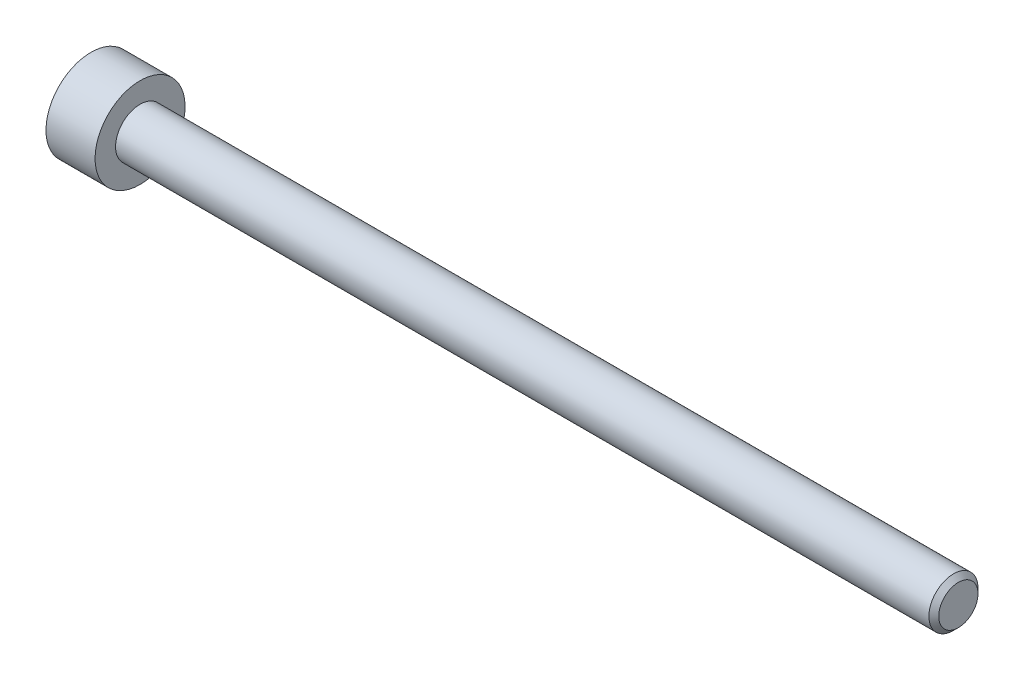
ISO-10303-21;
HEADER;
FILE_DESCRIPTION(('STEP AP214'),'2;1');
FILE_NAME('part.step','',(''),(''),'','','');
FILE_SCHEMA(('AUTOMOTIVE_DESIGN { 1 0 10303 214 1 1 1 1 }'));
ENDSEC;
DATA;
#1=APPLICATION_CONTEXT('core data for automotive mechanical design processes');
#2=APPLICATION_PROTOCOL_DEFINITION('international standard','automotive_design',2000,#1);
#3=PRODUCT_CONTEXT('',#1,'mechanical');
#4=PRODUCT('Part','Part','',(#3));
#5=PRODUCT_RELATED_PRODUCT_CATEGORY('part','',(#4));
#6=PRODUCT_DEFINITION_FORMATION('','',#4);
#7=PRODUCT_DEFINITION_CONTEXT('part definition',#1,'design');
#8=PRODUCT_DEFINITION('design','',#6,#7);
#9=PRODUCT_DEFINITION_SHAPE('','',#8);
#10=(LENGTH_UNIT() NAMED_UNIT(*) SI_UNIT(.MILLI.,.METRE.));
#11=(NAMED_UNIT(*) PLANE_ANGLE_UNIT() SI_UNIT($,.RADIAN.));
#12=(NAMED_UNIT(*) SI_UNIT($,.STERADIAN.) SOLID_ANGLE_UNIT());
#13=UNCERTAINTY_MEASURE_WITH_UNIT(LENGTH_MEASURE(1.E-05),#10,'distance_accuracy_value','');
#14=(GEOMETRIC_REPRESENTATION_CONTEXT(3) GLOBAL_UNCERTAINTY_ASSIGNED_CONTEXT((#13)) GLOBAL_UNIT_ASSIGNED_CONTEXT((#10,
#11,#12)) REPRESENTATION_CONTEXT('',''));
#15=CARTESIAN_POINT('',(0.,0.,0.));
#16=DIRECTION('',(0.,0.,1.));
#17=DIRECTION('',(1.,0.,0.));
#18=AXIS2_PLACEMENT_3D('',#15,#16,#17);
#19=CARTESIAN_POINT('',(-50.,0.,0.));
#20=DIRECTION('',(1.,0.,0.));
#21=DIRECTION('',(0.,0.,-1.));
#22=AXIS2_PLACEMENT_3D('',#19,#20,#21);
#23=CYLINDRICAL_SURFACE('',#22,1.5);
#24=CARTESIAN_POINT('',(-0.300000000000002,0.,0.));
#25=DIRECTION('',(1.,0.,0.));
#26=DIRECTION('',(0.,0.,-1.));
#27=AXIS2_PLACEMENT_3D('',#24,#25,#26);
#28=CIRCLE('',#27,1.5);
#29=CARTESIAN_POINT('',(-0.300000000000002,0.,-1.5));
#30=VERTEX_POINT('',#29);
#31=EDGE_CURVE('E46',#30,#30,#28,.F.);
#32=ORIENTED_EDGE('',*,*,#31,.T.);
#33=EDGE_LOOP('',(#32));
#34=FACE_BOUND('',#33,.T.);
#35=CARTESIAN_POINT('',(-50.,0.,0.));
#36=DIRECTION('',(-1.,0.,0.));
#37=DIRECTION('',(0.,-1.,0.));
#38=AXIS2_PLACEMENT_3D('',#35,#36,#37);
#39=CIRCLE('',#38,1.5);
#40=CARTESIAN_POINT('',(-50.,-1.50000000000001,0.));
#41=VERTEX_POINT('',#40);
#42=EDGE_CURVE('E122',#41,#41,#39,.F.);
#43=ORIENTED_EDGE('',*,*,#42,.T.);
#44=EDGE_LOOP('',(#43));
#45=FACE_BOUND('',#44,.T.);
#46=ADVANCED_FACE('F33',(#34,#45),#23,.T.);
#47=CARTESIAN_POINT('',(0.,0.,0.));
#48=DIRECTION('',(1.,0.,0.));
#49=DIRECTION('',(0.,0.,-1.));
#50=AXIS2_PLACEMENT_3D('',#47,#48,#49);
#51=PLANE('',#50);
#52=CARTESIAN_POINT('',(0.,0.,0.));
#53=DIRECTION('',(1.,0.,0.));
#54=DIRECTION('',(0.,0.,-1.));
#55=AXIS2_PLACEMENT_3D('',#52,#53,#54);
#56=CIRCLE('',#55,1.2);
#57=CARTESIAN_POINT('',(0.,0.,-1.2));
#58=VERTEX_POINT('',#57);
#59=EDGE_CURVE('E125',#58,#58,#56,.T.);
#60=ORIENTED_EDGE('',*,*,#59,.T.);
#61=EDGE_LOOP('',(#60));
#62=FACE_BOUND('',#61,.T.);
#63=ADVANCED_FACE('F135',(#62),#51,.T.);
#64=CARTESIAN_POINT('',(0.,0.,0.));
#65=DIRECTION('',(-1.,0.,0.));
#66=DIRECTION('',(0.,0.,1.));
#67=AXIS2_PLACEMENT_3D('',#64,#65,#66);
#68=CONICAL_SURFACE('',#67,1.2,0.785398163397447);
#69=ORIENTED_EDGE('',*,*,#31,.F.);
#70=EDGE_LOOP('',(#69));
#71=FACE_BOUND('',#70,.T.);
#72=ORIENTED_EDGE('',*,*,#59,.F.);
#73=EDGE_LOOP('',(#72));
#74=FACE_BOUND('',#73,.T.);
#75=ADVANCED_FACE('F35',(#71,#74),#68,.T.);
#76=CARTESIAN_POINT('',(-53.,0.,0.));
#77=DIRECTION('',(1.,0.,0.));
#78=DIRECTION('',(0.,1.,0.));
#79=AXIS2_PLACEMENT_3D('',#76,#77,#78);
#80=PLANE('',#79);
#81=CARTESIAN_POINT('',(-53.,1.83044599404149E-13,0.));
#82=DIRECTION('',(-1.,0.,0.));
#83=DIRECTION('',(0.,-1.,0.));
#84=AXIS2_PLACEMENT_3D('',#81,#82,#83);
#85=CIRCLE('',#84,1.49337567297404);
#86=CARTESIAN_POINT('',(-53.,-1.49337567297386,0.));
#87=VERTEX_POINT('',#86);
#88=EDGE_CURVE('E235',#87,#87,#85,.T.);
#89=ORIENTED_EDGE('',*,*,#88,.F.);
#90=EDGE_LOOP('',(#89));
#91=FACE_BOUND('',#90,.T.);
#92=CARTESIAN_POINT('',(-53.,0.,0.));
#93=DIRECTION('',(-1.,0.,0.));
#94=DIRECTION('',(0.,-1.,0.));
#95=AXIS2_PLACEMENT_3D('',#92,#93,#94);
#96=CIRCLE('',#95,2.75);
#97=CARTESIAN_POINT('',(-53.,-2.75,0.));
#98=VERTEX_POINT('',#97);
#99=EDGE_CURVE('E119',#98,#98,#96,.T.);
#100=ORIENTED_EDGE('',*,*,#99,.T.);
#101=EDGE_LOOP('',(#100));
#102=FACE_BOUND('',#101,.T.);
#103=ADVANCED_FACE('F134',(#91,#102),#80,.F.);
#104=CARTESIAN_POINT('',(-50.,0.,0.));
#105=DIRECTION('',(-1.,0.,0.));
#106=DIRECTION('',(0.,-1.,0.));
#107=AXIS2_PLACEMENT_3D('',#104,#105,#106);
#108=CYLINDRICAL_SURFACE('',#107,2.75);
#109=ORIENTED_EDGE('',*,*,#99,.F.);
#110=EDGE_LOOP('',(#109));
#111=FACE_BOUND('',#110,.T.);
#112=CARTESIAN_POINT('',(-50.,0.,0.));
#113=DIRECTION('',(-1.,0.,0.));
#114=DIRECTION('',(0.,-1.,0.));
#115=AXIS2_PLACEMENT_3D('',#112,#113,#114);
#116=CIRCLE('',#115,2.75);
#117=CARTESIAN_POINT('',(-50.,-2.75,0.));
#118=VERTEX_POINT('',#117);
#119=EDGE_CURVE('E116',#118,#118,#116,.T.);
#120=ORIENTED_EDGE('',*,*,#119,.T.);
#121=EDGE_LOOP('',(#120));
#122=FACE_BOUND('',#121,.T.);
#123=ADVANCED_FACE('F146',(#111,#122),#108,.T.);
#124=CARTESIAN_POINT('',(-50.,2.75,0.));
#125=DIRECTION('',(-1.,0.,0.));
#126=DIRECTION('',(0.,-1.,0.));
#127=AXIS2_PLACEMENT_3D('',#124,#125,#126);
#128=PLANE('',#127);
#129=ORIENTED_EDGE('',*,*,#42,.F.);
#130=EDGE_LOOP('',(#129));
#131=FACE_BOUND('',#130,.T.);
#132=ORIENTED_EDGE('',*,*,#119,.F.);
#133=EDGE_LOOP('',(#132));
#134=FACE_BOUND('',#133,.T.);
#135=ADVANCED_FACE('F150',(#131,#134),#128,.F.);
#136=CARTESIAN_POINT('',(-53.,1.83044599404149E-13,0.));
#137=DIRECTION('',(-1.,0.,0.));
#138=DIRECTION('',(0.,-1.,0.));
#139=AXIS2_PLACEMENT_3D('',#136,#137,#138);
#140=CONICAL_SURFACE('',#139,1.49337567297404,0.78539816339745);
#141=ORIENTED_EDGE('',*,*,#88,.T.);
#142=EDGE_LOOP('',(#141));
#143=FACE_BOUND('',#142,.T.);
#144=CARTESIAN_POINT('',(-53.4014021689884,-1.42396736984779,1.25));
#145=CARTESIAN_POINT('',(-53.3752961364481,-1.38922450814756,1.25));
#146=CARTESIAN_POINT('',(-53.3494506563432,-1.35428640192978,1.25));
#147=CARTESIAN_POINT('',(-53.2983879120234,-1.28394100441944,1.25));
#148=CARTESIAN_POINT('',(-53.2731708093588,-1.24853359598558,1.25));
#149=CARTESIAN_POINT('',(-53.1982633539511,-1.14097140016101,1.25));
#150=CARTESIAN_POINT('',(-53.1497190435972,-1.06800495826732,1.25));
#151=CARTESIAN_POINT('',(-53.0545600162985,-0.915095472420173,1.25));
#152=CARTESIAN_POINT('',(-53.0082030382604,-0.834990154954319,1.25));
#153=CARTESIAN_POINT('',(-52.9235039270025,-0.67079834895924,1.25));
#154=CARTESIAN_POINT('',(-52.8851347978723,-0.58672648793699,1.25));
#155=CARTESIAN_POINT('',(-52.8381985020476,-0.460385334768531,1.25));
#156=CARTESIAN_POINT('',(-52.8247021207699,-0.419954113336438,1.25));
#157=CARTESIAN_POINT('',(-52.8009573074475,-0.338129031291116,1.25));
#158=CARTESIAN_POINT('',(-52.7907091035293,-0.29673510328401,1.25));
#159=CARTESIAN_POINT('',(-52.7741594663553,-0.213916243687624,1.25));
#160=CARTESIAN_POINT('',(-52.7677913385526,-0.172504848949173,1.25));
#161=CARTESIAN_POINT('',(-52.7591237196609,-0.0892560954740315,1.25));
#162=CARTESIAN_POINT('',(-52.7568235599982,-0.0474188078701397,1.25));
#163=CARTESIAN_POINT('',(-52.7564564105194,0.0348235296906662,1.25));
#164=CARTESIAN_POINT('',(-52.7582455485416,0.0752279922918425,1.25));
#165=CARTESIAN_POINT('',(-52.7656448035135,0.15568700557977,1.25));
#166=CARTESIAN_POINT('',(-52.7712556629701,0.195741486738124,1.25));
#167=CARTESIAN_POINT('',(-52.7860898151071,0.275882483894831,1.25));
#168=CARTESIAN_POINT('',(-52.7953738895404,0.315957579678935,1.25));
#169=CARTESIAN_POINT('',(-52.8170656964993,0.395234027395441,1.25));
#170=CARTESIAN_POINT('',(-52.8294731489785,0.434435457319079,1.25));
#171=CARTESIAN_POINT('',(-52.8734108304631,0.558570325397279,1.25));
#172=CARTESIAN_POINT('',(-52.909974414329,0.641718054006102,1.25));
#173=CARTESIAN_POINT('',(-52.9912478873067,0.804100725662247,1.25));
#174=CARTESIAN_POINT('',(-53.0359871895298,0.883320183916037,1.25));
#175=CARTESIAN_POINT('',(-53.1282652286461,1.03470895505839,1.25));
#176=CARTESIAN_POINT('',(-53.1755534388818,1.10703287925054,1.25));
#177=CARTESIAN_POINT('',(-53.2486463209253,1.21358798649207,1.25));
#178=CARTESIAN_POINT('',(-53.2732664432996,1.24864609054898,1.25));
#179=CARTESIAN_POINT('',(-53.3231552601311,1.31828380805665,1.25));
#180=CARTESIAN_POINT('',(-53.3484237758018,1.3528635494471,1.25));
#181=CARTESIAN_POINT('',(-53.3739610581169,1.38724419886404,1.25));
#182=B_SPLINE_CURVE_WITH_KNOTS('',3,(#144,#145,#146,#147,#148,#149,#150,#151,#152,#153,#154,
#155,#156,#157,#158,#159,#160,#161,#162,#163,#164,#165,#166,#167,#168,#169,#170,#171,#172,#173,
#174,#175,#176,#177,#178,#179,#180,#181),.UNSPECIFIED.,.F.,.F.,(4,2,2,2,2,2,2,2,2,2,2,2,2,2,2,2,
2,2,4),(0.,0.130370422461745,0.26077402322927,0.523571931962165,0.800995227642772,
1.07746514553939,1.2052297268728,1.33300327939669,1.45851355132212,1.58400319361986,
1.70514602294318,1.82631239533593,1.94957373840988,2.07282403363802,2.34451838945518,
2.61721016161581,2.87631588769059,3.00482945023597,3.13330794967359),.UNSPECIFIED.);
#183=CARTESIAN_POINT('',(-52.95,-0.72168783648685,1.25));
#184=VERTEX_POINT('',#183);
#185=CARTESIAN_POINT('',(-52.95,0.721687836487215,1.25));
#186=VERTEX_POINT('',#185);
#187=EDGE_CURVE('E100',#184,#186,#182,.T.);
#188=ORIENTED_EDGE('',*,*,#187,.F.);
#189=CARTESIAN_POINT('',(-52.9501154839092,-1.44349114302772,-0.000200000000000036));
#190=CARTESIAN_POINT('',(-52.9253216680551,-1.41867941875047,0.0427751670715862));
#191=CARTESIAN_POINT('',(-52.9019837344187,-1.39345276980725,0.086469004745948));
#192=CARTESIAN_POINT('',(-52.8592520040846,-1.34201263554176,0.175565930841943));
#193=CARTESIAN_POINT('',(-52.8398819923604,-1.31579425481258,0.220977498357066));
#194=CARTESIAN_POINT('',(-52.8067004834135,-1.26292610442228,0.312547820935263));
#195=CARTESIAN_POINT('',(-52.7928055590527,-1.23628980770453,0.358683240175889));
#196=CARTESIAN_POINT('',(-52.7713972821607,-1.1824306253849,0.451970080407596));
#197=CARTESIAN_POINT('',(-52.7638679415668,-1.15520938653743,0.499118649136384));
#198=CARTESIAN_POINT('',(-52.7570744980507,-1.10829684367448,0.580373556887257));
#199=CARTESIAN_POINT('',(-52.7560685591044,-1.08866617256939,0.614374876627945));
#200=CARTESIAN_POINT('',(-52.7577614149114,-1.04943932800592,0.682317764432482));
#201=CARTESIAN_POINT('',(-52.7604610272156,-1.02984316311581,0.716259317655662));
#202=CARTESIAN_POINT('',(-52.7694089303164,-0.990839954603314,0.783814856457504));
#203=CARTESIAN_POINT('',(-52.7756605258997,-0.971433104248585,0.81742850728678));
#204=CARTESIAN_POINT('',(-52.7913756814139,-0.93294339560972,0.884094638217818));
#205=CARTESIAN_POINT('',(-52.8008406200875,-0.913860680098115,0.9171468710303));
#206=CARTESIAN_POINT('',(-52.8289313906876,-0.864986351354384,1.00179969160027));
#207=CARTESIAN_POINT('',(-52.8496701574522,-0.835502920148893,1.05286649242964));
#208=CARTESIAN_POINT('',(-52.8963871346715,-0.777690319475726,1.15300085411325));
#209=CARTESIAN_POINT('',(-52.9223482959468,-0.749357745598233,1.20207431157827));
#210=CARTESIAN_POINT('',(-52.9501154839092,-0.721572366433011,1.2502));
#211=B_SPLINE_CURVE_WITH_KNOTS('',3,(#189,#190,#191,#192,#193,#194,#195,#196,#197,#198,#199,
#200,#201,#202,#203,#204,#205,#206,#207,#208,#209,#210),.UNSPECIFIED.,.F.,.F.,(4,2,2,2,2,2,2,2,
2,2,4),(0.,0.166533409618304,0.334037607289763,0.498880396489702,0.663307919240279,
0.780963963458831,0.898645970148458,1.01643764860774,1.1342799317155,1.3214865203214,
1.50809158792574),.UNSPECIFIED.);
#212=CARTESIAN_POINT('',(-52.95,-1.44337567297388,0.));
#213=VERTEX_POINT('',#212);
#214=EDGE_CURVE('E192',#213,#184,#211,.T.);
#215=ORIENTED_EDGE('',*,*,#214,.F.);
#216=CARTESIAN_POINT('',(-52.9501154839092,-0.721572366433011,-1.2502));
#217=CARTESIAN_POINT('',(-52.9253216680551,-0.746384090710261,-1.20722483292841));
#218=CARTESIAN_POINT('',(-52.9019837344187,-0.771610739653482,-1.16353099525405));
#219=CARTESIAN_POINT('',(-52.8592520040846,-0.823050873918973,-1.07443406915806));
#220=CARTESIAN_POINT('',(-52.8398819923604,-0.849269254648152,-1.02902250164293));
#221=CARTESIAN_POINT('',(-52.8067004834135,-0.902137405038455,-0.937452179064736));
#222=CARTESIAN_POINT('',(-52.7928055590527,-0.928773701756207,-0.891316759824109));
#223=CARTESIAN_POINT('',(-52.7713972821607,-0.982632884075834,-0.798029919592401));
#224=CARTESIAN_POINT('',(-52.7638679415668,-1.0098541229233,-0.750881350863614));
#225=CARTESIAN_POINT('',(-52.7570744980507,-1.05676666578625,-0.669626443112742));
#226=CARTESIAN_POINT('',(-52.7560685591044,-1.07639733689134,-0.635625123372054));
#227=CARTESIAN_POINT('',(-52.7577614149114,-1.11562418145481,-0.567682235567517));
#228=CARTESIAN_POINT('',(-52.7604610272156,-1.13522034634492,-0.533740682344337));
#229=CARTESIAN_POINT('',(-52.7694089303164,-1.17422355485742,-0.466185143542494));
#230=CARTESIAN_POINT('',(-52.7756605258997,-1.19363040521215,-0.432571492713218));
#231=CARTESIAN_POINT('',(-52.7913756814139,-1.23212011385101,-0.36590536178218));
#232=CARTESIAN_POINT('',(-52.8008406200875,-1.25120282936262,-0.332853128969698));
#233=CARTESIAN_POINT('',(-52.8289313906876,-1.30007715810635,-0.248200308399731));
#234=CARTESIAN_POINT('',(-52.8496701574522,-1.32956058931184,-0.197133507570358));
#235=CARTESIAN_POINT('',(-52.8963871346715,-1.38737318998501,-0.096999145886744));
#236=CARTESIAN_POINT('',(-52.9223482959468,-1.4157057638625,-0.0479256884217305));
#237=CARTESIAN_POINT('',(-52.9501154839092,-1.44349114302772,0.000199999999998401));
#238=B_SPLINE_CURVE_WITH_KNOTS('',3,(#216,#217,#218,#219,#220,#221,#222,#223,#224,#225,#226,
#227,#228,#229,#230,#231,#232,#233,#234,#235,#236,#237),.UNSPECIFIED.,.F.,.F.,(4,2,2,2,2,2,2,2,
2,2,4),(0.,0.166533409618306,0.334037607289768,0.498880396489707,0.663307919240282,
0.780963963458834,0.898645970148461,1.01643764860774,1.1342799317155,1.32148652032141,
1.50809158792573),.UNSPECIFIED.);
#239=CARTESIAN_POINT('',(-52.95,-0.721687836486849,-1.25));
#240=VERTEX_POINT('',#239);
#241=EDGE_CURVE('E187',#240,#213,#238,.T.);
#242=ORIENTED_EDGE('',*,*,#241,.F.);
#243=CARTESIAN_POINT('',(-53.4014021689884,-1.42396736984779,-1.25));
#244=CARTESIAN_POINT('',(-53.3752961364481,-1.38922450814756,-1.25));
#245=CARTESIAN_POINT('',(-53.3494506563432,-1.35428640192978,-1.25));
#246=CARTESIAN_POINT('',(-53.2983879120234,-1.28394100441944,-1.25));
#247=CARTESIAN_POINT('',(-53.2731708093588,-1.24853359598558,-1.25));
#248=CARTESIAN_POINT('',(-53.1982633539511,-1.14097140016101,-1.25));
#249=CARTESIAN_POINT('',(-53.1497190435972,-1.06800495826732,-1.25));
#250=CARTESIAN_POINT('',(-53.0545600162985,-0.915095472420172,-1.25));
#251=CARTESIAN_POINT('',(-53.0082030382604,-0.834990154954318,-1.25));
#252=CARTESIAN_POINT('',(-52.9235039270025,-0.670798348959239,-1.25));
#253=CARTESIAN_POINT('',(-52.8851347978723,-0.586726487936988,-1.25));
#254=CARTESIAN_POINT('',(-52.8381985020476,-0.46038533476853,-1.25));
#255=CARTESIAN_POINT('',(-52.8247021207699,-0.419954113336438,-1.25));
#256=CARTESIAN_POINT('',(-52.8009573074475,-0.338129031291118,-1.25));
#257=CARTESIAN_POINT('',(-52.7907091035293,-0.296735103284012,-1.25));
#258=CARTESIAN_POINT('',(-52.7741594663553,-0.213916243687626,-1.25));
#259=CARTESIAN_POINT('',(-52.7677913385526,-0.172504848949175,-1.25));
#260=CARTESIAN_POINT('',(-52.7591237196609,-0.0892560954740335,-1.25));
#261=CARTESIAN_POINT('',(-52.7568235599982,-0.0474188078701416,-1.25));
#262=CARTESIAN_POINT('',(-52.7564564105194,0.0348235296906646,-1.25));
#263=CARTESIAN_POINT('',(-52.7582455485416,0.0752279922918411,-1.25));
#264=CARTESIAN_POINT('',(-52.7656448035135,0.155687005579769,-1.25));
#265=CARTESIAN_POINT('',(-52.7712556629701,0.195741486738123,-1.25));
#266=CARTESIAN_POINT('',(-52.7860898151071,0.27588248389483,-1.25));
#267=CARTESIAN_POINT('',(-52.7953738895404,0.315957579678934,-1.25));
#268=CARTESIAN_POINT('',(-52.8170656964993,0.395234027395441,-1.25));
#269=CARTESIAN_POINT('',(-52.8294731489785,0.434435457319079,-1.25));
#270=CARTESIAN_POINT('',(-52.8734108304631,0.558570325397279,-1.25));
#271=CARTESIAN_POINT('',(-52.909974414329,0.641718054006102,-1.25));
#272=CARTESIAN_POINT('',(-52.9912478873067,0.804100725662245,-1.25));
#273=CARTESIAN_POINT('',(-53.0359871895298,0.883320183916035,-1.25));
#274=CARTESIAN_POINT('',(-53.1282652286461,1.03470895505838,-1.25));
#275=CARTESIAN_POINT('',(-53.1755534388818,1.10703287925054,-1.25));
#276=CARTESIAN_POINT('',(-53.2486463209253,1.21358798649207,-1.25));
#277=CARTESIAN_POINT('',(-53.2732664432996,1.24864609054898,-1.25));
#278=CARTESIAN_POINT('',(-53.3231552601311,1.31828380805665,-1.25));
#279=CARTESIAN_POINT('',(-53.3484237758018,1.3528635494471,-1.25));
#280=CARTESIAN_POINT('',(-53.3739610581169,1.38724419886404,-1.25));
#281=B_SPLINE_CURVE_WITH_KNOTS('',3,(#243,#244,#245,#246,#247,#248,#249,#250,#251,#252,#253,
#254,#255,#256,#257,#258,#259,#260,#261,#262,#263,#264,#265,#266,#267,#268,#269,#270,#271,#272,
#273,#274,#275,#276,#277,#278,#279,#280),.UNSPECIFIED.,.F.,.F.,(4,2,2,2,2,2,2,2,2,2,2,2,2,2,2,2,
2,2,4),(0.,0.130370422461745,0.260774023229269,0.523571931962165,0.800995227642772,
1.07746514553939,1.2052297268728,1.33300327939668,1.45851355132212,1.58400319361986,
1.70514602294318,1.82631239533593,1.94957373840988,2.07282403363802,2.34451838945518,
2.61721016161581,2.87631588769058,3.00482945023597,3.13330794967358),.UNSPECIFIED.);
#282=CARTESIAN_POINT('',(-52.95,0.721687836487215,-1.25));
#283=VERTEX_POINT('',#282);
#284=EDGE_CURVE('E53',#283,#240,#281,.F.);
#285=ORIENTED_EDGE('',*,*,#284,.F.);
#286=CARTESIAN_POINT('',(-52.9501154839092,1.44349114302809,0.000200000000001351));
#287=CARTESIAN_POINT('',(-52.9253216680551,1.41867941875083,-0.042775167071587));
#288=CARTESIAN_POINT('',(-52.9019837344187,1.39345276980761,-0.0864690047459488));
#289=CARTESIAN_POINT('',(-52.8592520040846,1.34201263554212,-0.175565930841943));
#290=CARTESIAN_POINT('',(-52.8398819923604,1.31579425481295,-0.220977498357064));
#291=CARTESIAN_POINT('',(-52.8067004834135,1.26292610442264,-0.312547820935261));
#292=CARTESIAN_POINT('',(-52.7928055590527,1.23628980770489,-0.358683240175889));
#293=CARTESIAN_POINT('',(-52.7713972821607,1.18243062538526,-0.451970080407597));
#294=CARTESIAN_POINT('',(-52.7638679415668,1.15520938653779,-0.499118649136384));
#295=CARTESIAN_POINT('',(-52.7570744980507,1.10829684367485,-0.580373556887257));
#296=CARTESIAN_POINT('',(-52.7560685591044,1.08866617256976,-0.614374876627946));
#297=CARTESIAN_POINT('',(-52.7577614149113,1.04943932800629,-0.682317764432483));
#298=CARTESIAN_POINT('',(-52.7604610272156,1.02984316311617,-0.716259317655663));
#299=CARTESIAN_POINT('',(-52.7694089303164,0.990839954603678,-0.783814856457505));
#300=CARTESIAN_POINT('',(-52.7756605258997,0.971433104248949,-0.817428507286781));
#301=CARTESIAN_POINT('',(-52.7913756814139,0.932943395610084,-0.884094638217819));
#302=CARTESIAN_POINT('',(-52.8008406200875,0.913860680098479,-0.917146871030302));
#303=CARTESIAN_POINT('',(-52.8289313906876,0.864986351354747,-1.00179969160027));
#304=CARTESIAN_POINT('',(-52.8496701574522,0.835502920149256,-1.05286649242964));
#305=CARTESIAN_POINT('',(-52.8963871346715,0.77769031947609,-1.15300085411326));
#306=CARTESIAN_POINT('',(-52.9223482959468,0.749357745598599,-1.20207431157827));
#307=CARTESIAN_POINT('',(-52.9501154839092,0.721572366433378,-1.2502));
#308=B_SPLINE_CURVE_WITH_KNOTS('',3,(#286,#287,#288,#289,#290,#291,#292,#293,#294,#295,#296,
#297,#298,#299,#300,#301,#302,#303,#304,#305,#306,#307),.UNSPECIFIED.,.F.,.F.,(4,2,2,2,2,2,2,2,
2,2,4),(0.,0.166533409618306,0.334037607289766,0.498880396489705,0.663307919240282,
0.780963963458835,0.898645970148461,1.01643764860774,1.1342799317155,1.32148652032141,
1.50809158792574),.UNSPECIFIED.);
#309=CARTESIAN_POINT('',(-52.95,1.44337567297425,0.));
#310=VERTEX_POINT('',#309);
#311=EDGE_CURVE('E11',#310,#283,#308,.T.);
#312=ORIENTED_EDGE('',*,*,#311,.F.);
#313=CARTESIAN_POINT('',(-52.9501154839092,0.721572366433377,1.2502));
#314=CARTESIAN_POINT('',(-52.9253216680551,0.746384090710626,1.20722483292841));
#315=CARTESIAN_POINT('',(-52.9019837344187,0.771610739653846,1.16353099525405));
#316=CARTESIAN_POINT('',(-52.8592520040846,0.823050873919337,1.07443406915806));
#317=CARTESIAN_POINT('',(-52.8398819923604,0.849269254648517,1.02902250164293));
#318=CARTESIAN_POINT('',(-52.8067004834135,0.90213740503882,0.937452179064737));
#319=CARTESIAN_POINT('',(-52.7928055590527,0.928773701756571,0.891316759824112));
#320=CARTESIAN_POINT('',(-52.7713972821607,0.982632884076197,0.798029919592404));
#321=CARTESIAN_POINT('',(-52.7638679415668,1.00985412292367,0.750881350863616));
#322=CARTESIAN_POINT('',(-52.7570744980507,1.05676666578661,0.669626443112742));
#323=CARTESIAN_POINT('',(-52.7560685591044,1.0763973368917,0.635625123372054));
#324=CARTESIAN_POINT('',(-52.7577614149113,1.11562418145517,0.567682235567517));
#325=CARTESIAN_POINT('',(-52.7604610272156,1.13522034634529,0.533740682344337));
#326=CARTESIAN_POINT('',(-52.7694089303164,1.17422355485778,0.466185143542495));
#327=CARTESIAN_POINT('',(-52.7756605258997,1.19363040521251,0.43257149271322));
#328=CARTESIAN_POINT('',(-52.7913756814139,1.23212011385138,0.365905361782182));
#329=CARTESIAN_POINT('',(-52.8008406200875,1.25120282936298,0.332853128969699));
#330=CARTESIAN_POINT('',(-52.8289313906876,1.30007715810671,0.248200308399731));
#331=CARTESIAN_POINT('',(-52.8496701574522,1.32956058931221,0.197133507570358));
#332=CARTESIAN_POINT('',(-52.8963871346715,1.38737318998537,0.0969991458867434));
#333=CARTESIAN_POINT('',(-52.9223482959468,1.41570576386286,0.0479256884217296));
#334=CARTESIAN_POINT('',(-52.9501154839092,1.44349114302809,-0.000200000000000298));
#335=B_SPLINE_CURVE_WITH_KNOTS('',3,(#313,#314,#315,#316,#317,#318,#319,#320,#321,#322,#323,
#324,#325,#326,#327,#328,#329,#330,#331,#332,#333,#334),.UNSPECIFIED.,.F.,.F.,(4,2,2,2,2,2,2,2,
2,2,4),(0.,0.166533409618302,0.334037607289763,0.498880396489701,0.663307919240279,
0.780963963458832,0.898645970148458,1.01643764860774,1.1342799317155,1.32148652032141,
1.50809158792574),.UNSPECIFIED.);
#336=EDGE_CURVE('E91',#186,#310,#335,.T.);
#337=ORIENTED_EDGE('',*,*,#336,.F.);
#338=EDGE_LOOP('',(#188,#215,#242,#285,#312,#337));
#339=FACE_BOUND('',#338,.T.);
#340=ADVANCED_FACE('F90',(#143,#339),#140,.F.);
#341=CARTESIAN_POINT('',(-51.4,5.03476744051005E-13,0.));
#342=DIRECTION('',(-1.,0.,0.));
#343=DIRECTION('',(0.,-1.,0.));
#344=AXIS2_PLACEMENT_3D('',#341,#342,#343);
#345=PLANE('',#344);
#346=DIRECTION('',(0.,0.5,-0.866025403784439));
#347=VECTOR('',#346,1.);
#348=CARTESIAN_POINT('',(-51.4,0.721687836487209,1.25));
#349=LINE('',#348,#347);
#350=CARTESIAN_POINT('',(-51.4,0.721687836487209,1.25));
#351=VERTEX_POINT('',#350);
#352=CARTESIAN_POINT('',(-51.4,1.44337567297424,0.));
#353=VERTEX_POINT('',#352);
#354=EDGE_CURVE('E99',#351,#353,#349,.T.);
#355=ORIENTED_EDGE('',*,*,#354,.T.);
#356=DIRECTION('',(0.,-0.5,-0.866025403784439));
#357=VECTOR('',#356,1.);
#358=CARTESIAN_POINT('',(-51.4,1.44337567297424,0.));
#359=LINE('',#358,#357);
#360=CARTESIAN_POINT('',(-51.4,0.721687836487209,-1.25));
#361=VERTEX_POINT('',#360);
#362=EDGE_CURVE('E104',#353,#361,#359,.T.);
#363=ORIENTED_EDGE('',*,*,#362,.T.);
#364=DIRECTION('',(0.,-1.,0.));
#365=VECTOR('',#364,1.);
#366=CARTESIAN_POINT('',(-51.4,0.721687836487209,-1.25));
#367=LINE('',#366,#365);
#368=CARTESIAN_POINT('',(-51.4,-0.721687836486855,-1.25));
#369=VERTEX_POINT('',#368);
#370=EDGE_CURVE('E217',#361,#369,#367,.T.);
#371=ORIENTED_EDGE('',*,*,#370,.T.);
#372=DIRECTION('',(0.,-0.5,0.866025403784439));
#373=VECTOR('',#372,1.);
#374=CARTESIAN_POINT('',(-51.4,-0.721687836486855,-1.25));
#375=LINE('',#374,#373);
#376=CARTESIAN_POINT('',(-51.4,-1.44337567297389,0.));
#377=VERTEX_POINT('',#376);
#378=EDGE_CURVE('E221',#369,#377,#375,.T.);
#379=ORIENTED_EDGE('',*,*,#378,.T.);
#380=DIRECTION('',(0.,0.5,0.866025403784439));
#381=VECTOR('',#380,1.);
#382=CARTESIAN_POINT('',(-51.4,-1.44337567297389,0.));
#383=LINE('',#382,#381);
#384=CARTESIAN_POINT('',(-51.4,-0.721687836486856,1.25));
#385=VERTEX_POINT('',#384);
#386=EDGE_CURVE('E112',#377,#385,#383,.T.);
#387=ORIENTED_EDGE('',*,*,#386,.T.);
#388=DIRECTION('',(0.,1.,0.));
#389=VECTOR('',#388,1.);
#390=CARTESIAN_POINT('',(-51.4,-0.721687836486856,1.25));
#391=LINE('',#390,#389);
#392=EDGE_CURVE('E107',#385,#351,#391,.T.);
#393=ORIENTED_EDGE('',*,*,#392,.T.);
#394=EDGE_LOOP('',(#355,#363,#371,#379,#387,#393));
#395=FACE_BOUND('',#394,.T.);
#396=ADVANCED_FACE('F174',(#395),#345,.T.);
#397=CARTESIAN_POINT('',(-51.4,1.44337567297424,0.));
#398=DIRECTION('',(0.,0.866025403784439,-0.5));
#399=DIRECTION('',(0.,0.5,0.866025403784439));
#400=AXIS2_PLACEMENT_3D('',#397,#398,#399);
#401=PLANE('',#400);
#402=DIRECTION('',(-1.,0.,0.));
#403=VECTOR('',#402,1.);
#404=CARTESIAN_POINT('',(-51.4,1.44337567297424,0.));
#405=LINE('',#404,#403);
#406=EDGE_CURVE('E97',#353,#310,#405,.T.);
#407=ORIENTED_EDGE('',*,*,#406,.T.);
#408=ORIENTED_EDGE('',*,*,#311,.T.);
#409=DIRECTION('',(-1.,0.,0.));
#410=VECTOR('',#409,1.);
#411=CARTESIAN_POINT('',(-51.4,0.721687836487209,-1.25));
#412=LINE('',#411,#410);
#413=EDGE_CURVE('E106',#361,#283,#412,.T.);
#414=ORIENTED_EDGE('',*,*,#413,.F.);
#415=ORIENTED_EDGE('',*,*,#362,.F.);
#416=EDGE_LOOP('',(#407,#408,#414,#415));
#417=FACE_BOUND('',#416,.T.);
#418=ADVANCED_FACE('F102',(#417),#401,.F.);
#419=CARTESIAN_POINT('',(-51.4,0.721687836487209,-1.25));
#420=DIRECTION('',(0.,0.,-1.));
#421=DIRECTION('',(-1.,0.,0.));
#422=AXIS2_PLACEMENT_3D('',#419,#420,#421);
#423=PLANE('',#422);
#424=ORIENTED_EDGE('',*,*,#413,.T.);
#425=ORIENTED_EDGE('',*,*,#284,.T.);
#426=DIRECTION('',(-1.,0.,0.));
#427=VECTOR('',#426,1.);
#428=CARTESIAN_POINT('',(-51.4,-0.721687836486855,-1.25));
#429=LINE('',#428,#427);
#430=EDGE_CURVE('E109',#369,#240,#429,.T.);
#431=ORIENTED_EDGE('',*,*,#430,.F.);
#432=ORIENTED_EDGE('',*,*,#370,.F.);
#433=EDGE_LOOP('',(#424,#425,#431,#432));
#434=FACE_BOUND('',#433,.T.);
#435=ADVANCED_FACE('F206',(#434),#423,.F.);
#436=CARTESIAN_POINT('',(-51.4,-0.721687836486855,-1.25));
#437=DIRECTION('',(0.,-0.866025403784438,-0.5));
#438=DIRECTION('',(0.,0.5,-0.866025403784439));
#439=AXIS2_PLACEMENT_3D('',#436,#437,#438);
#440=PLANE('',#439);
#441=ORIENTED_EDGE('',*,*,#430,.T.);
#442=ORIENTED_EDGE('',*,*,#241,.T.);
#443=DIRECTION('',(-1.,0.,0.));
#444=VECTOR('',#443,1.);
#445=CARTESIAN_POINT('',(-51.4,-1.44337567297389,0.));
#446=LINE('',#445,#444);
#447=EDGE_CURVE('E231',#377,#213,#446,.T.);
#448=ORIENTED_EDGE('',*,*,#447,.F.);
#449=ORIENTED_EDGE('',*,*,#378,.F.);
#450=EDGE_LOOP('',(#441,#442,#448,#449));
#451=FACE_BOUND('',#450,.T.);
#452=ADVANCED_FACE('F201',(#451),#440,.F.);
#453=CARTESIAN_POINT('',(-51.4,-1.44337567297389,0.));
#454=DIRECTION('',(0.,-0.866025403784439,0.5));
#455=DIRECTION('',(0.,-0.5,-0.866025403784439));
#456=AXIS2_PLACEMENT_3D('',#453,#454,#455);
#457=PLANE('',#456);
#458=ORIENTED_EDGE('',*,*,#447,.T.);
#459=ORIENTED_EDGE('',*,*,#214,.T.);
#460=DIRECTION('',(-1.,0.,0.));
#461=VECTOR('',#460,1.);
#462=CARTESIAN_POINT('',(-51.4,-0.721687836486856,1.25));
#463=LINE('',#462,#461);
#464=EDGE_CURVE('E228',#385,#184,#463,.T.);
#465=ORIENTED_EDGE('',*,*,#464,.F.);
#466=ORIENTED_EDGE('',*,*,#386,.F.);
#467=EDGE_LOOP('',(#458,#459,#465,#466));
#468=FACE_BOUND('',#467,.T.);
#469=ADVANCED_FACE('F198',(#468),#457,.F.);
#470=CARTESIAN_POINT('',(-51.4,-0.721687836486856,1.25));
#471=DIRECTION('',(0.,0.,1.));
#472=DIRECTION('',(1.,0.,0.));
#473=AXIS2_PLACEMENT_3D('',#470,#471,#472);
#474=PLANE('',#473);
#475=ORIENTED_EDGE('',*,*,#464,.T.);
#476=ORIENTED_EDGE('',*,*,#187,.T.);
#477=DIRECTION('',(-1.,0.,0.));
#478=VECTOR('',#477,1.);
#479=CARTESIAN_POINT('',(-51.4,0.721687836487209,1.25));
#480=LINE('',#479,#478);
#481=EDGE_CURVE('E60',#351,#186,#480,.T.);
#482=ORIENTED_EDGE('',*,*,#481,.F.);
#483=ORIENTED_EDGE('',*,*,#392,.F.);
#484=EDGE_LOOP('',(#475,#476,#482,#483));
#485=FACE_BOUND('',#484,.T.);
#486=ADVANCED_FACE('F157',(#485),#474,.F.);
#487=CARTESIAN_POINT('',(-51.4,0.721687836487209,1.25));
#488=DIRECTION('',(0.,0.866025403784439,0.5));
#489=DIRECTION('',(0.,-0.5,0.866025403784439));
#490=AXIS2_PLACEMENT_3D('',#487,#488,#489);
#491=PLANE('',#490);
#492=ORIENTED_EDGE('',*,*,#481,.T.);
#493=ORIENTED_EDGE('',*,*,#336,.T.);
#494=ORIENTED_EDGE('',*,*,#406,.F.);
#495=ORIENTED_EDGE('',*,*,#354,.F.);
#496=EDGE_LOOP('',(#492,#493,#494,#495));
#497=FACE_BOUND('',#496,.T.);
#498=ADVANCED_FACE('F96',(#497),#491,.F.);
#499=CLOSED_SHELL('',(#46,#63,#75,#103,#123,#135,#340,#396,#418,#435,#452,#469,#486,#498));
#500=MANIFOLD_SOLID_BREP('B2',#499);
#501=ADVANCED_BREP_SHAPE_REPRESENTATION('',(#18,#500),#14);
#502=SHAPE_DEFINITION_REPRESENTATION(#9,#501);
ENDSEC;
END-ISO-10303-21;
